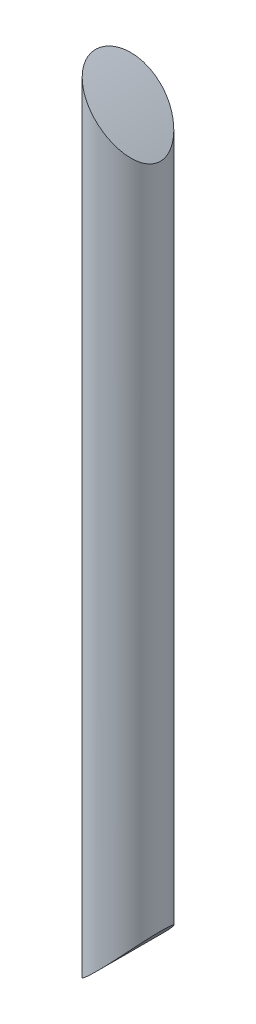
ISO-10303-21;
HEADER;
FILE_DESCRIPTION(('STEP AP214'),'2;1');
FILE_NAME('part.step','',(''),(''),'','','');
FILE_SCHEMA(('AUTOMOTIVE_DESIGN { 1 0 10303 214 1 1 1 1 }'));
ENDSEC;
DATA;
#1=APPLICATION_CONTEXT('core data for automotive mechanical design processes');
#2=APPLICATION_PROTOCOL_DEFINITION('international standard','automotive_design',2000,#1);
#3=PRODUCT_CONTEXT('',#1,'mechanical');
#4=PRODUCT('Part','Part','',(#3));
#5=PRODUCT_RELATED_PRODUCT_CATEGORY('part','',(#4));
#6=PRODUCT_DEFINITION_FORMATION('','',#4);
#7=PRODUCT_DEFINITION_CONTEXT('part definition',#1,'design');
#8=PRODUCT_DEFINITION('design','',#6,#7);
#9=PRODUCT_DEFINITION_SHAPE('','',#8);
#10=(LENGTH_UNIT() NAMED_UNIT(*) SI_UNIT(.MILLI.,.METRE.));
#11=(NAMED_UNIT(*) PLANE_ANGLE_UNIT() SI_UNIT($,.RADIAN.));
#12=(NAMED_UNIT(*) SI_UNIT($,.STERADIAN.) SOLID_ANGLE_UNIT());
#13=UNCERTAINTY_MEASURE_WITH_UNIT(LENGTH_MEASURE(1.E-05),#10,'distance_accuracy_value','');
#14=(GEOMETRIC_REPRESENTATION_CONTEXT(3) GLOBAL_UNCERTAINTY_ASSIGNED_CONTEXT((#13)) GLOBAL_UNIT_ASSIGNED_CONTEXT((#10,
#11,#12)) REPRESENTATION_CONTEXT('',''));
#15=CARTESIAN_POINT('',(0.,0.,0.));
#16=DIRECTION('',(0.,0.,1.));
#17=DIRECTION('',(1.,0.,0.));
#18=AXIS2_PLACEMENT_3D('',#15,#16,#17);
#19=CARTESIAN_POINT('',(0.,70.,0.));
#20=DIRECTION('',(0.,-1.,0.));
#21=DIRECTION('',(0.,0.,-1.));
#22=AXIS2_PLACEMENT_3D('',#19,#20,#21);
#23=CYLINDRICAL_SURFACE('',#22,2.);
#24=CARTESIAN_POINT('',(0.,12.2458794940345,-2.));
#25=CARTESIAN_POINT('',(0.158902924572715,12.4030152814935,-2.00000525474973));
#26=CARTESIAN_POINT('',(0.316448927775543,12.5621316060111,-1.98111165084151));
#27=CARTESIAN_POINT('',(0.547003712104524,12.7998191207985,-1.92537512479546));
#28=CARTESIAN_POINT('',(0.623035327299899,12.8790352814788,-1.90215902124447));
#29=CARTESIAN_POINT('',(0.772651328110402,13.0364973880097,-1.84644855596712));
#30=CARTESIAN_POINT('',(0.846236823606091,13.1147437634887,-1.8139584681036));
#31=CARTESIAN_POINT('',(1.02531269395083,13.3070455787266,-1.72141526342418));
#32=CARTESIAN_POINT('',(1.12899602589395,13.4200915892774,-1.65563374388356));
#33=CARTESIAN_POINT('',(1.32688183614903,13.6387899227312,-1.5016853768834));
#34=CARTESIAN_POINT('',(1.4211085918221,13.7444609546689,-1.41357801019493));
#35=CARTESIAN_POINT('',(1.56710219925136,13.9101324701534,-1.24584706789922));
#36=CARTESIAN_POINT('',(1.62261820198334,13.9736950443754,-1.17302206484676));
#37=CARTESIAN_POINT('',(1.72552212098687,14.0923410669491,-1.0155748447881));
#38=CARTESIAN_POINT('',(1.7729210947957,14.1474360397424,-0.930968966145143));
#39=CARTESIAN_POINT('',(1.84706746649427,14.2340954851673,-0.770858109266668));
#40=CARTESIAN_POINT('',(1.87605638133441,14.2681559817051,-0.697759188001526));
#41=CARTESIAN_POINT('',(1.9259088698064,14.326914509499,-0.545245340271901));
#42=CARTESIAN_POINT('',(1.94677927435701,14.351620411248,-0.465835791628092));
#43=CARTESIAN_POINT('',(1.97891746197285,14.3897295953538,-0.301565987890485));
#44=CARTESIAN_POINT('',(1.99009257048731,14.4030237839587,-0.216661289019647));
#45=CARTESIAN_POINT('',(2.00133317240322,14.4163957968918,-0.0451030473209491));
#46=CARTESIAN_POINT('',(2.00140757138602,14.4164842155932,0.0415490378373105));
#47=CARTESIAN_POINT('',(1.99126123948908,14.4044141574368,0.20081260444077));
#48=CARTESIAN_POINT('',(1.98250789273512,14.3940012552514,0.273663383097891));
#49=CARTESIAN_POINT('',(1.95755147042409,14.3643863910679,0.416215026433125));
#50=CARTESIAN_POINT('',(1.94134499429596,14.3451804171534,0.485914437305016));
#51=CARTESIAN_POINT('',(1.89646824115019,14.2921785037724,0.641764973740252));
#52=CARTESIAN_POINT('',(1.86549331031242,14.2557072373058,0.726336531946916));
#53=CARTESIAN_POINT('',(1.79487874507532,14.1730504012913,0.886634808899338));
#54=CARTESIAN_POINT('',(1.75522242940651,14.1268461363423,0.962344062899915));
#55=CARTESIAN_POINT('',(1.65054373047197,14.0057132721761,1.13576793510498));
#56=CARTESIAN_POINT('',(1.58199485889986,13.9270373425985,1.22871065007728));
#57=CARTESIAN_POINT('',(1.4353309852337,13.7605954461359,1.39726438264986));
#58=CARTESIAN_POINT('',(1.3571966475123,13.6728111629061,1.47283945461853));
#59=CARTESIAN_POINT('',(1.21705564919138,13.5172404837203,1.58888061560111));
#60=CARTESIAN_POINT('',(1.15671447377272,13.4507955722942,1.63323742325338));
#61=CARTESIAN_POINT('',(1.033099316983,13.3158668927671,1.71410713076591));
#62=CARTESIAN_POINT('',(0.969824125650775,13.2473822877552,1.75061675891027));
#63=CARTESIAN_POINT('',(0.776351508211366,13.0398752878897,1.84884548149076));
#64=CARTESIAN_POINT('',(0.642496160829279,12.8987875892012,1.89927313638297));
#65=CARTESIAN_POINT('',(0.365287468734544,12.6120690950544,1.97169362132185));
#66=CARTESIAN_POINT('',(0.221783673704643,12.4664102449564,1.99297897158895));
#67=CARTESIAN_POINT('',(-0.0686451393325957,12.1772883114138,2.00408853177541));
#68=CARTESIAN_POINT('',(-0.215568019639911,12.033823944235,1.99393190196039));
#69=CARTESIAN_POINT('',(-0.487636221658021,11.7731601087486,1.94383007985083));
#70=CARTESIAN_POINT('',(-0.612852227173639,11.6551671022573,1.90841464085063));
#71=CARTESIAN_POINT('',(-0.859458966280035,11.426389748393,1.81076535482124));
#72=CARTESIAN_POINT('',(-0.980854356768233,11.315596434831,1.74856563014555));
#73=CARTESIAN_POINT('',(-1.18551946568619,11.1314652546561,1.61417714642311));
#74=CARTESIAN_POINT('',(-1.27074962894922,11.0556752086313,1.54834348583973));
#75=CARTESIAN_POINT('',(-1.43306528305045,10.9127442722101,1.39943279750736));
#76=CARTESIAN_POINT('',(-1.51016206312801,10.8455913641851,1.31638015800024));
#77=CARTESIAN_POINT('',(-1.63790394093864,10.7352393349588,1.15145769162459));
#78=CARTESIAN_POINT('',(-1.6907504499386,10.6899389425965,1.07270970443017));
#79=CARTESIAN_POINT('',(-1.78621942895881,10.6085418863867,0.904834346643328));
#80=CARTESIAN_POINT('',(-1.82884558899807,10.5724419004694,0.815710739446957));
#81=CARTESIAN_POINT('',(-1.90154567660534,10.5111048811978,0.627958729412371));
#82=CARTESIAN_POINT('',(-1.93151212077495,10.4859608113709,0.529257356667232));
#83=CARTESIAN_POINT('',(-1.97596980414846,10.4487260010941,0.326070105859205));
#84=CARTESIAN_POINT('',(-1.99047605108871,10.4366226014993,0.221589941318817));
#85=CARTESIAN_POINT('',(-2.00189994902712,10.427089584901,0.0256799433966626));
#86=CARTESIAN_POINT('',(-2.00098321010604,10.4278532688799,-0.0655439609371905));
#87=CARTESIAN_POINT('',(-1.98683945899693,10.4396594070274,-0.246338008441389));
#88=CARTESIAN_POINT('',(-1.97361489463556,10.4506998173222,-0.335908476840913));
#89=CARTESIAN_POINT('',(-1.93653789483255,10.4817502282606,-0.507132442374678));
#90=CARTESIAN_POINT('',(-1.91315010164782,10.5013682939726,-0.588960263970893));
#91=CARTESIAN_POINT('',(-1.85717185341897,10.548517831605,-0.746956034955319));
#92=CARTESIAN_POINT('',(-1.82457960742289,10.5760508435911,-0.823122879214768));
#93=CARTESIAN_POINT('',(-1.74819421898041,10.6409095859274,-0.975584332054876));
#94=CARTESIAN_POINT('',(-1.70362911522213,10.6789189802506,-1.05119785610968));
#95=CARTESIAN_POINT('',(-1.6071829325156,10.7617193281097,-1.19346773183101));
#96=CARTESIAN_POINT('',(-1.5552975614429,10.806514261384,-1.2601187833896));
#97=CARTESIAN_POINT('',(-1.41879525288348,10.9252315884905,-1.41503515924611));
#98=CARTESIAN_POINT('',(-1.33070405762459,11.0025842266258,-1.49763351681954));
#99=CARTESIAN_POINT('',(-1.1466067196838,11.1662449558656,-1.64289694506224));
#100=CARTESIAN_POINT('',(-1.05058015582719,11.2525763105023,-1.70550843416467));
#101=CARTESIAN_POINT('',(-0.822628861648465,11.4601986011534,-1.82894641118165));
#102=CARTESIAN_POINT('',(-0.689060129550479,11.5838281000224,-1.88277344392309));
#103=CARTESIAN_POINT('',(-0.419892852650026,11.8374644077661,-1.96043137797684));
#104=CARTESIAN_POINT('',(-0.284297348414641,11.96746222238,-1.98430338542129));
#105=CARTESIAN_POINT('',(-0.099560236860698,12.1477516419804,-1.99814691461057));
#106=CARTESIAN_POINT('',(-0.0497137115189741,12.1967186417213,-1.99999835602074));
#107=CARTESIAN_POINT('',(0.,12.2458794940345,-2.));
#108=B_SPLINE_CURVE_WITH_KNOTS('',3,(#24,#25,#26,#27,#28,#29,#30,#31,#32,#33,#34,#35,#36,#37,
#38,#39,#40,#41,#42,#43,#44,#45,#46,#47,#48,#49,#50,#51,#52,#53,#54,#55,#56,#57,#58,#59,#60,#61,
#62,#63,#64,#65,#66,#67,#68,#69,#70,#71,#72,#73,#74,#75,#76,#77,#78,#79,#80,#81,#82,#83,#84,#85,
#86,#87,#88,#89,#90,#91,#92,#93,#94,#95,#96,#97,#98,#99,#100,#101,#102,#103,#104,#105,#106,
#107),.UNSPECIFIED.,.T.,.F.,(4,2,2,2,2,2,2,2,2,2,2,2,2,2,2,2,2,2,2,2,2,2,2,2,2,2,2,2,2,2,2,2,2,
2,2,2,2,2,2,2,2,4),(0.,0.670185621418104,1.00657562757201,1.34281085990361,1.84187931758264,
2.33963188032821,2.67309271498277,3.00609561051935,3.26224472091716,3.5181778387172,
3.77653121407,4.03467732344813,4.25599140774688,4.47740656932992,4.76730697421922,
5.05776938967636,5.47470308402199,5.89249208231947,6.19246555420888,6.4925638521392,
7.09270569112371,7.70717307142579,8.32126607835412,8.84637434654762,9.37081561300641,
9.76452532663988,10.1576811698448,10.4717617325522,10.7857287263053,11.1023102488371,
11.4185841742782,11.6908710473197,11.9631037784927,12.2240200561685,12.4849871365221,
12.7708516829819,13.0568845436659,13.484728116722,13.913709220064,14.4801367466995,
15.0457861334932,15.2554576341086),.UNSPECIFIED.);
#109=CARTESIAN_POINT('',(0.,12.2458794940345,-2.));
#110=VERTEX_POINT('',#109);
#111=EDGE_CURVE('E50',#110,#110,#108,.T.);
#112=ORIENTED_EDGE('',*,*,#111,.F.);
#113=EDGE_LOOP('',(#112));
#114=FACE_BOUND('',#113,.T.);
#115=CARTESIAN_POINT('',(0.,57.7541205059655,-2.));
#116=CARTESIAN_POINT('',(-0.11986172678712,57.8726423149002,-2.00000251133549));
#117=CARTESIAN_POINT('',(-0.240740701820135,57.9902880756937,-1.98924915387287));
#118=CARTESIAN_POINT('',(-0.482330385606482,58.221761933694,-1.94485407563981));
#119=CARTESIAN_POINT('',(-0.603040718590327,58.3355852822249,-1.91118491508182));
#120=CARTESIAN_POINT('',(-0.829879183031363,58.5462850028319,-1.82336784015188));
#121=CARTESIAN_POINT('',(-0.936311220967923,58.6437485246321,-1.77144316927277));
#122=CARTESIAN_POINT('',(-1.14306998399282,58.8306707187078,-1.64559851869582));
#123=CARTESIAN_POINT('',(-1.24340514468414,58.9201405356003,-1.57170980327824));
#124=CARTESIAN_POINT('',(-1.41176502179031,59.0685683143337,-1.42009772760252));
#125=CARTESIAN_POINT('',(-1.48195262718864,59.1298410996262,-1.34705622513545));
#126=CARTESIAN_POINT('',(-1.61303213792613,59.2433921831236,-1.18692668379694));
#127=CARTESIAN_POINT('',(-1.67393533759897,59.2956814196736,-1.09985598091572));
#128=CARTESIAN_POINT('',(-1.77337283906016,59.3805340283204,-0.929042818133954));
#129=CARTESIAN_POINT('',(-1.81395785279112,59.4149499040781,-0.847421418130921));
#130=CARTESIAN_POINT('',(-1.88439317881709,59.4744537790074,-0.67645510660761));
#131=CARTESIAN_POINT('',(-1.91424853407574,59.4995461604308,-0.587113847994864));
#132=CARTESIAN_POINT('',(-1.96145274407633,59.5391330109846,-0.402300034104058));
#133=CARTESIAN_POINT('',(-1.97872744562892,59.5535646503449,-0.306794680709492));
#134=CARTESIAN_POINT('',(-1.99915670948606,59.5706250284411,-0.113250151376781));
#135=CARTESIAN_POINT('',(-2.00231758172827,59.5732590416002,-0.0152121274534234));
#136=CARTESIAN_POINT('',(-1.99469839338779,59.5669007544582,0.169990608664081));
#137=CARTESIAN_POINT('',(-1.98528896599619,59.5590515413345,0.257256886454186));
#138=CARTESIAN_POINT('',(-1.95548876254095,59.5341278881451,0.428506115229232));
#139=CARTESIAN_POINT('',(-1.93509836708348,59.5170537678195,0.512489179903869));
#140=CARTESIAN_POINT('',(-1.88423410117597,59.4742987495832,0.676081609087233));
#141=CARTESIAN_POINT('',(-1.85365005649953,59.4485237709018,0.755631585123047));
#142=CARTESIAN_POINT('',(-1.78400411306992,59.3895387153225,0.907940521926392));
#143=CARTESIAN_POINT('',(-1.74493804709056,59.3563249835033,0.980696119391627));
#144=CARTESIAN_POINT('',(-1.64348998061032,59.2695685148246,1.14522125128567));
#145=CARTESIAN_POINT('',(-1.57792539318463,59.2131249157862,1.2335079513162));
#146=CARTESIAN_POINT('',(-1.43735447276812,59.0909460868008,1.39481613364053));
#147=CARTESIAN_POINT('',(-1.36233092109805,59.0251938843645,1.46780911406024));
#148=CARTESIAN_POINT('',(-1.18122953274931,58.8648027439872,1.61947694848449));
#149=CARTESIAN_POINT('',(-1.07282981045858,58.7676011301659,1.69265918801088));
#150=CARTESIAN_POINT('',(-0.850257534222187,58.5650471843559,1.81472376371726));
#151=CARTESIAN_POINT('',(-0.736077573038742,58.459684297348,1.86357400374892));
#152=CARTESIAN_POINT('',(-0.472303518438249,58.2125354773802,1.94969610879304));
#153=CARTESIAN_POINT('',(-0.32196054752937,58.0689828238175,1.97960797746318));
#154=CARTESIAN_POINT('',(-0.0226598388386057,57.7774682065482,2.00551898374029));
#155=CARTESIAN_POINT('',(0.126295980784685,57.6295010669481,2.00147661789211));
#156=CARTESIAN_POINT('',(0.420975287740193,57.3309936275009,1.96090868092416));
#157=CARTESIAN_POINT('',(0.566636947418907,57.1804439922857,1.92398636723749));
#158=CARTESIAN_POINT('',(0.778350675675609,56.9574358788374,1.84386829174052));
#159=CARTESIAN_POINT('',(0.847789341376823,56.8835722843814,1.81304165262745));
#160=CARTESIAN_POINT('',(0.983941174350157,56.7373976374612,1.74290594533415));
#161=CARTESIAN_POINT('',(1.05065539823001,56.6650859883761,1.70360020344441));
#162=CARTESIAN_POINT('',(1.20541912860329,56.4958307644371,1.59958315641611));
#163=CARTESIAN_POINT('',(1.29198214301919,56.3999279396252,1.53088751140954));
#164=CARTESIAN_POINT('',(1.45642949261969,56.2156699852958,1.37535293486391));
#165=CARTESIAN_POINT('',(1.53432769727629,56.127302848154,1.28854365706367));
#166=CARTESIAN_POINT('',(1.6571737598768,55.9865919369324,1.12299630659896));
#167=CARTESIAN_POINT('',(1.70515320278698,55.9311991211179,1.04912320951394));
#168=CARTESIAN_POINT('',(1.79284909938165,55.8293537099801,0.890974718980357));
#169=CARTESIAN_POINT('',(1.83257809091557,55.7828875573691,0.806715424177376));
#170=CARTESIAN_POINT('',(1.89360227595099,55.7112020344056,0.647939857774383));
#171=CARTESIAN_POINT('',(1.91702978010041,55.6835575379011,0.575351415797566));
#172=CARTESIAN_POINT('',(1.95581499766052,55.6376844971723,0.425185118614659));
#173=CARTESIAN_POINT('',(1.97117994709346,55.619447510099,0.347611807693926));
#174=CARTESIAN_POINT('',(1.99268556501423,55.5938983175079,0.188830519607062));
#175=CARTESIAN_POINT('',(1.99876280608926,55.5866612341031,0.107601415935427));
#176=CARTESIAN_POINT('',(2.00089356386824,55.584125443161,-0.0551712284514088));
#177=CARTESIAN_POINT('',(1.99694928927081,55.5888241050371,-0.1367146959271));
#178=CARTESIAN_POINT('',(1.98034836588372,55.6085583361457,-0.288924739258757));
#179=CARTESIAN_POINT('',(1.96863051718551,55.6224798534242,-0.359846800780676));
#180=CARTESIAN_POINT('',(1.93829073518523,55.6584243713256,-0.498038001689534));
#181=CARTESIAN_POINT('',(1.91966575206417,55.6804509506745,-0.565305512358257));
#182=CARTESIAN_POINT('',(1.86794789123554,55.7413901264545,-0.721054519201106));
#183=CARTESIAN_POINT('',(1.83204693534608,55.7835344925395,-0.80733552345748));
#184=CARTESIAN_POINT('',(1.75144442550882,55.8775308715205,-0.969906672802814));
#185=CARTESIAN_POINT('',(1.70672403657161,55.9294036488095,-1.04617484323804));
#186=CARTESIAN_POINT('',(1.5888285451786,56.0651275875664,-1.22117188652042));
#187=CARTESIAN_POINT('',(1.51194614913882,56.1528131432237,-1.31440265843072));
#188=CARTESIAN_POINT('',(1.3484379182448,56.3369931322294,-1.48170233360161));
#189=CARTESIAN_POINT('',(1.26178928726383,56.4335080718145,-1.55572501521187));
#190=CARTESIAN_POINT('',(1.10845024424323,56.6020816398,-1.66655416185456));
#191=CARTESIAN_POINT('',(1.04352344617103,56.6728402001807,-1.70787395833056));
#192=CARTESIAN_POINT('',(0.910848252987964,56.816089176915,-1.78217350073954));
#193=CARTESIAN_POINT('',(0.843098537978757,56.8885803964906,-1.81514929316414));
#194=CARTESIAN_POINT('',(0.636619121329008,57.1073923292669,-1.90183707090884));
#195=CARTESIAN_POINT('',(0.494352140566417,57.2553899395548,-1.94352494005608));
#196=CARTESIAN_POINT('',(0.29194432597668,57.4618367774895,-1.97943762570009));
#197=CARTESIAN_POINT('',(0.234004679115366,57.5204766817939,-1.98712477647189));
#198=CARTESIAN_POINT('',(0.117458286688533,57.6375215784506,-1.99740452879681));
#199=CARTESIAN_POINT('',(0.058851761513245,57.6959266402461,-1.99999876694153));
#200=CARTESIAN_POINT('',(0.,57.7541205059655,-2.));
#201=B_SPLINE_CURVE_WITH_KNOTS('',3,(#115,#116,#117,#118,#119,#120,#121,#122,#123,#124,#125,
#126,#127,#128,#129,#130,#131,#132,#133,#134,#135,#136,#137,#138,#139,#140,#141,#142,#143,#144,
#145,#146,#147,#148,#149,#150,#151,#152,#153,#154,#155,#156,#157,#158,#159,#160,#161,#162,#163,
#164,#165,#166,#167,#168,#169,#170,#171,#172,#173,#174,#175,#176,#177,#178,#179,#180,#181,#182,
#183,#184,#185,#186,#187,#188,#189,#190,#191,#192,#193,#194,#195,#196,#197,#198,#199,#200),
.UNSPECIFIED.,.T.,.F.,(4,2,2,2,2,2,2,2,2,2,2,2,2,2,2,2,2,2,2,2,2,2,2,2,2,2,2,2,2,2,2,2,2,2,2,2,
2,2,2,2,2,2,4),(0.,0.505498047065875,1.0116024538019,1.47011907801477,1.92798613598491,
2.28186860926653,2.63531709453125,2.92643292992588,3.21741176073038,3.5100921032799,
3.8026415827091,4.06575696716656,4.32886323249262,4.59491074220838,4.86108925832171,
5.22988303483746,5.59935811147535,6.08558091343275,6.57244340065813,7.1991982706584,
7.82671935656352,8.46191652892796,8.77948834968367,9.09693581513883,9.53458356828101,
9.97152039405362,10.2827322863608,10.5934677257287,10.8359193670317,11.0781530378304,
11.3220336877211,11.5658605920362,11.7845840579892,12.0034042156675,12.3092349757189,
12.6157260895636,13.0612013830913,13.5077389142573,13.8209772015408,14.1343636288533,
14.7596377479508,15.0079156248189,15.2561137052968),.UNSPECIFIED.);
#202=CARTESIAN_POINT('',(0.,57.7541205059655,-2.));
#203=VERTEX_POINT('',#202);
#204=EDGE_CURVE('E10',#203,#203,#201,.T.);
#205=ORIENTED_EDGE('',*,*,#204,.F.);
#206=EDGE_LOOP('',(#205));
#207=FACE_BOUND('',#206,.T.);
#208=ADVANCED_FACE('F40',(#114,#207),#23,.T.);
#209=CARTESIAN_POINT('',(-22.5,35.,-2.));
#210=DIRECTION('',(0.,0.,1.));
#211=DIRECTION('',(1.,0.,0.));
#212=AXIS2_PLACEMENT_3D('',#209,#210,#211);
#213=CYLINDRICAL_SURFACE('',#212,32.);
#214=ORIENTED_EDGE('',*,*,#111,.T.);
#215=EDGE_LOOP('',(#214));
#216=FACE_BOUND('',#215,.T.);
#217=ADVANCED_FACE('F62',(#216),#213,.T.);
#218=ORIENTED_EDGE('',*,*,#204,.T.);
#219=EDGE_LOOP('',(#218));
#220=FACE_BOUND('',#219,.T.);
#221=ADVANCED_FACE('F59',(#220),#213,.T.);
#222=CLOSED_SHELL('',(#208,#217,#221));
#223=MANIFOLD_SOLID_BREP('B2',#222);
#224=ADVANCED_BREP_SHAPE_REPRESENTATION('',(#18,#223),#14);
#225=SHAPE_DEFINITION_REPRESENTATION(#9,#224);
ENDSEC;
END-ISO-10303-21;
